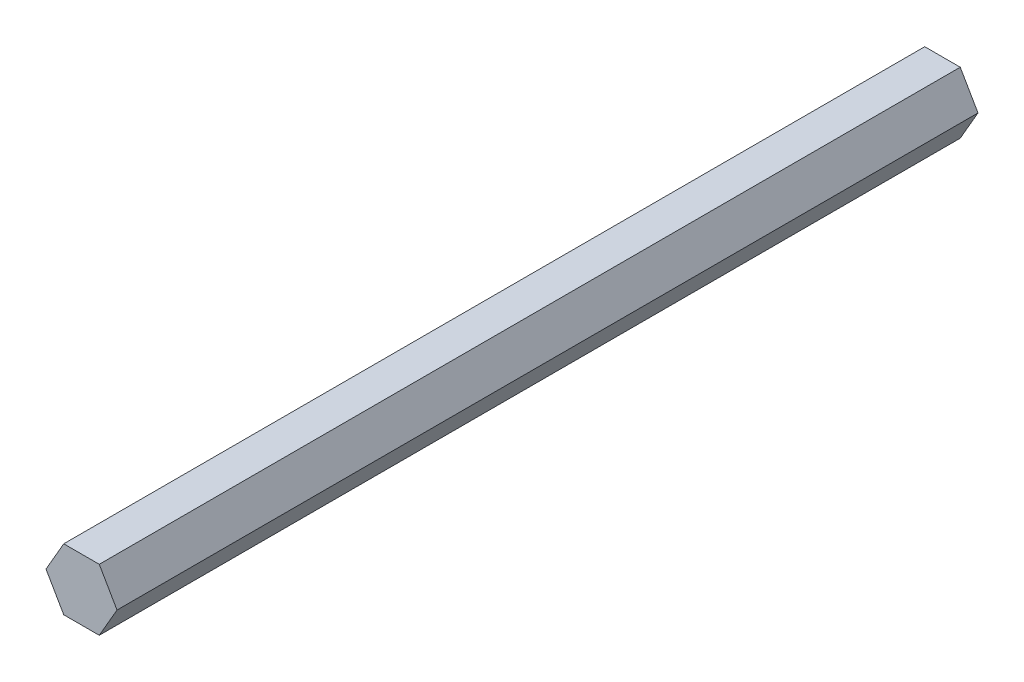
ISO-10303-21;
HEADER;
FILE_DESCRIPTION(('STEP AP214'),'2;1');
FILE_NAME('part.step','',(''),(''),'','','');
FILE_SCHEMA(('AUTOMOTIVE_DESIGN { 1 0 10303 214 1 1 1 1 }'));
ENDSEC;
DATA;
#1=APPLICATION_CONTEXT('core data for automotive mechanical design processes');
#2=APPLICATION_PROTOCOL_DEFINITION('international standard','automotive_design',2000,#1);
#3=PRODUCT_CONTEXT('',#1,'mechanical');
#4=PRODUCT('Part','Part','',(#3));
#5=PRODUCT_RELATED_PRODUCT_CATEGORY('part','',(#4));
#6=PRODUCT_DEFINITION_FORMATION('','',#4);
#7=PRODUCT_DEFINITION_CONTEXT('part definition',#1,'design');
#8=PRODUCT_DEFINITION('design','',#6,#7);
#9=PRODUCT_DEFINITION_SHAPE('','',#8);
#10=(LENGTH_UNIT() NAMED_UNIT(*) SI_UNIT(.MILLI.,.METRE.));
#11=(NAMED_UNIT(*) PLANE_ANGLE_UNIT() SI_UNIT($,.RADIAN.));
#12=(NAMED_UNIT(*) SI_UNIT($,.STERADIAN.) SOLID_ANGLE_UNIT());
#13=UNCERTAINTY_MEASURE_WITH_UNIT(LENGTH_MEASURE(1.E-05),#10,'distance_accuracy_value','');
#14=(GEOMETRIC_REPRESENTATION_CONTEXT(3) GLOBAL_UNCERTAINTY_ASSIGNED_CONTEXT((#13)) GLOBAL_UNIT_ASSIGNED_CONTEXT((#10,
#11,#12)) REPRESENTATION_CONTEXT('',''));
#15=CARTESIAN_POINT('',(0.,0.,0.));
#16=DIRECTION('',(0.,0.,1.));
#17=DIRECTION('',(1.,0.,0.));
#18=AXIS2_PLACEMENT_3D('',#15,#16,#17);
#19=CARTESIAN_POINT('',(7.33234841870825,0.,88.9));
#20=DIRECTION('',(-0.866025403784439,-0.5,0.));
#21=DIRECTION('',(0.5,-0.866025403784439,0.));
#22=AXIS2_PLACEMENT_3D('',#19,#20,#21);
#23=PLANE('',#22);
#24=DIRECTION('',(-0.5,0.866025403784439,0.));
#25=VECTOR('',#24,1.);
#26=CARTESIAN_POINT('',(7.33234841870825,0.,-88.9));
#27=LINE('',#26,#25);
#28=CARTESIAN_POINT('',(7.33234841870825,0.,-88.9));
#29=VERTEX_POINT('',#28);
#30=CARTESIAN_POINT('',(3.66617420935413,6.35,-88.9));
#31=VERTEX_POINT('',#30);
#32=EDGE_CURVE('E117',#29,#31,#27,.T.);
#33=ORIENTED_EDGE('',*,*,#32,.T.);
#34=DIRECTION('',(0.,0.,-1.));
#35=VECTOR('',#34,1.);
#36=CARTESIAN_POINT('',(3.66617420935413,6.35,88.9));
#37=LINE('',#36,#35);
#38=CARTESIAN_POINT('',(3.66617420935413,6.35,88.9));
#39=VERTEX_POINT('',#38);
#40=EDGE_CURVE('E11',#39,#31,#37,.T.);
#41=ORIENTED_EDGE('',*,*,#40,.F.);
#42=DIRECTION('',(-0.5,0.866025403784439,0.));
#43=VECTOR('',#42,1.);
#44=CARTESIAN_POINT('',(7.33234841870825,0.,88.9));
#45=LINE('',#44,#43);
#46=CARTESIAN_POINT('',(7.33234841870825,0.,88.9));
#47=VERTEX_POINT('',#46);
#48=EDGE_CURVE('E127',#47,#39,#45,.T.);
#49=ORIENTED_EDGE('',*,*,#48,.F.);
#50=DIRECTION('',(0.,0.,-1.));
#51=VECTOR('',#50,1.);
#52=CARTESIAN_POINT('',(7.33234841870825,0.,88.9));
#53=LINE('',#52,#51);
#54=EDGE_CURVE('E113',#47,#29,#53,.T.);
#55=ORIENTED_EDGE('',*,*,#54,.T.);
#56=EDGE_LOOP('',(#33,#41,#49,#55));
#57=FACE_BOUND('',#56,.T.);
#58=ADVANCED_FACE('F33',(#57),#23,.F.);
#59=CARTESIAN_POINT('',(3.66617420935413,6.35,88.9));
#60=DIRECTION('',(0.,-1.,0.));
#61=DIRECTION('',(1.,0.,0.));
#62=AXIS2_PLACEMENT_3D('',#59,#60,#61);
#63=PLANE('',#62);
#64=DIRECTION('',(-1.,0.,0.));
#65=VECTOR('',#64,1.);
#66=CARTESIAN_POINT('',(3.66617420935413,6.35,-88.9));
#67=LINE('',#66,#65);
#68=CARTESIAN_POINT('',(-3.66617420935412,6.35,-88.9));
#69=VERTEX_POINT('',#68);
#70=EDGE_CURVE('E120',#31,#69,#67,.T.);
#71=ORIENTED_EDGE('',*,*,#70,.T.);
#72=DIRECTION('',(0.,0.,-1.));
#73=VECTOR('',#72,1.);
#74=CARTESIAN_POINT('',(-3.66617420935412,6.35,88.9));
#75=LINE('',#74,#73);
#76=CARTESIAN_POINT('',(-3.66617420935412,6.35,88.9));
#77=VERTEX_POINT('',#76);
#78=EDGE_CURVE('E41',#77,#69,#75,.T.);
#79=ORIENTED_EDGE('',*,*,#78,.F.);
#80=DIRECTION('',(-1.,0.,0.));
#81=VECTOR('',#80,1.);
#82=CARTESIAN_POINT('',(3.66617420935413,6.35,88.9));
#83=LINE('',#82,#81);
#84=EDGE_CURVE('E86',#39,#77,#83,.T.);
#85=ORIENTED_EDGE('',*,*,#84,.F.);
#86=ORIENTED_EDGE('',*,*,#40,.T.);
#87=EDGE_LOOP('',(#71,#79,#85,#86));
#88=FACE_BOUND('',#87,.T.);
#89=ADVANCED_FACE('F151',(#88),#63,.F.);
#90=CARTESIAN_POINT('',(-3.66617420935412,6.35,88.9));
#91=DIRECTION('',(0.866025403784439,-0.5,0.));
#92=DIRECTION('',(0.5,0.866025403784439,0.));
#93=AXIS2_PLACEMENT_3D('',#90,#91,#92);
#94=PLANE('',#93);
#95=DIRECTION('',(-0.5,-0.866025403784439,0.));
#96=VECTOR('',#95,1.);
#97=CARTESIAN_POINT('',(-3.66617420935412,6.35,-88.9));
#98=LINE('',#97,#96);
#99=CARTESIAN_POINT('',(-7.33234841870824,0.,-88.9));
#100=VERTEX_POINT('',#99);
#101=EDGE_CURVE('E122',#69,#100,#98,.T.);
#102=ORIENTED_EDGE('',*,*,#101,.T.);
#103=DIRECTION('',(0.,0.,-1.));
#104=VECTOR('',#103,1.);
#105=CARTESIAN_POINT('',(-7.33234841870824,0.,88.9));
#106=LINE('',#105,#104);
#107=CARTESIAN_POINT('',(-7.33234841870824,0.,88.9));
#108=VERTEX_POINT('',#107);
#109=EDGE_CURVE('E108',#108,#100,#106,.T.);
#110=ORIENTED_EDGE('',*,*,#109,.F.);
#111=DIRECTION('',(-0.5,-0.866025403784439,0.));
#112=VECTOR('',#111,1.);
#113=CARTESIAN_POINT('',(-3.66617420935412,6.35,88.9));
#114=LINE('',#113,#112);
#115=EDGE_CURVE('E99',#77,#108,#114,.T.);
#116=ORIENTED_EDGE('',*,*,#115,.F.);
#117=ORIENTED_EDGE('',*,*,#78,.T.);
#118=EDGE_LOOP('',(#102,#110,#116,#117));
#119=FACE_BOUND('',#118,.T.);
#120=ADVANCED_FACE('F133',(#119),#94,.F.);
#121=CARTESIAN_POINT('',(-7.33234841870824,0.,88.9));
#122=DIRECTION('',(0.866025403784439,0.5,0.));
#123=DIRECTION('',(-0.5,0.866025403784439,0.));
#124=AXIS2_PLACEMENT_3D('',#121,#122,#123);
#125=PLANE('',#124);
#126=DIRECTION('',(0.5,-0.866025403784439,0.));
#127=VECTOR('',#126,1.);
#128=CARTESIAN_POINT('',(-7.33234841870824,0.,-88.9));
#129=LINE('',#128,#127);
#130=CARTESIAN_POINT('',(-3.66617420935412,-6.35,-88.9));
#131=VERTEX_POINT('',#130);
#132=EDGE_CURVE('E107',#100,#131,#129,.T.);
#133=ORIENTED_EDGE('',*,*,#132,.T.);
#134=DIRECTION('',(0.,0.,-1.));
#135=VECTOR('',#134,1.);
#136=CARTESIAN_POINT('',(-3.66617420935412,-6.35,88.9));
#137=LINE('',#136,#135);
#138=CARTESIAN_POINT('',(-3.66617420935412,-6.35,88.9));
#139=VERTEX_POINT('',#138);
#140=EDGE_CURVE('E104',#139,#131,#137,.T.);
#141=ORIENTED_EDGE('',*,*,#140,.F.);
#142=DIRECTION('',(0.5,-0.866025403784439,0.));
#143=VECTOR('',#142,1.);
#144=CARTESIAN_POINT('',(-7.33234841870824,0.,88.9));
#145=LINE('',#144,#143);
#146=EDGE_CURVE('E93',#108,#139,#145,.T.);
#147=ORIENTED_EDGE('',*,*,#146,.F.);
#148=ORIENTED_EDGE('',*,*,#109,.T.);
#149=EDGE_LOOP('',(#133,#141,#147,#148));
#150=FACE_BOUND('',#149,.T.);
#151=ADVANCED_FACE('F105',(#150),#125,.F.);
#152=CARTESIAN_POINT('',(-3.66617420935412,-6.35,88.9));
#153=DIRECTION('',(0.,1.,0.));
#154=DIRECTION('',(-1.,0.,0.));
#155=AXIS2_PLACEMENT_3D('',#152,#153,#154);
#156=PLANE('',#155);
#157=DIRECTION('',(1.,0.,0.));
#158=VECTOR('',#157,1.);
#159=CARTESIAN_POINT('',(-3.66617420935412,-6.35,-88.9));
#160=LINE('',#159,#158);
#161=CARTESIAN_POINT('',(3.66617420935412,-6.35,-88.9));
#162=VERTEX_POINT('',#161);
#163=EDGE_CURVE('E72',#131,#162,#160,.T.);
#164=ORIENTED_EDGE('',*,*,#163,.T.);
#165=DIRECTION('',(0.,0.,-1.));
#166=VECTOR('',#165,1.);
#167=CARTESIAN_POINT('',(3.66617420935412,-6.35,88.9));
#168=LINE('',#167,#166);
#169=CARTESIAN_POINT('',(3.66617420935412,-6.35,88.9));
#170=VERTEX_POINT('',#169);
#171=EDGE_CURVE('E109',#170,#162,#168,.T.);
#172=ORIENTED_EDGE('',*,*,#171,.F.);
#173=DIRECTION('',(1.,0.,0.));
#174=VECTOR('',#173,1.);
#175=CARTESIAN_POINT('',(-3.66617420935412,-6.35,88.9));
#176=LINE('',#175,#174);
#177=EDGE_CURVE('E97',#139,#170,#176,.T.);
#178=ORIENTED_EDGE('',*,*,#177,.F.);
#179=ORIENTED_EDGE('',*,*,#140,.T.);
#180=EDGE_LOOP('',(#164,#172,#178,#179));
#181=FACE_BOUND('',#180,.T.);
#182=ADVANCED_FACE('F111',(#181),#156,.F.);
#183=CARTESIAN_POINT('',(3.66617420935412,-6.35,88.9));
#184=DIRECTION('',(-0.866025403784439,0.5,0.));
#185=DIRECTION('',(-0.5,-0.866025403784439,0.));
#186=AXIS2_PLACEMENT_3D('',#183,#184,#185);
#187=PLANE('',#186);
#188=DIRECTION('',(0.5,0.866025403784439,0.));
#189=VECTOR('',#188,1.);
#190=CARTESIAN_POINT('',(3.66617420935412,-6.35,-88.9));
#191=LINE('',#190,#189);
#192=EDGE_CURVE('E78',#162,#29,#191,.T.);
#193=ORIENTED_EDGE('',*,*,#192,.T.);
#194=ORIENTED_EDGE('',*,*,#54,.F.);
#195=DIRECTION('',(0.5,0.866025403784439,0.));
#196=VECTOR('',#195,1.);
#197=CARTESIAN_POINT('',(3.66617420935412,-6.35,88.9));
#198=LINE('',#197,#196);
#199=EDGE_CURVE('E49',#170,#47,#198,.T.);
#200=ORIENTED_EDGE('',*,*,#199,.F.);
#201=ORIENTED_EDGE('',*,*,#171,.T.);
#202=EDGE_LOOP('',(#193,#194,#200,#201));
#203=FACE_BOUND('',#202,.T.);
#204=ADVANCED_FACE('F140',(#203),#187,.F.);
#205=CARTESIAN_POINT('',(0.,0.,88.9));
#206=DIRECTION('',(0.,0.,1.));
#207=DIRECTION('',(1.,0.,0.));
#208=AXIS2_PLACEMENT_3D('',#205,#206,#207);
#209=PLANE('',#208);
#210=ORIENTED_EDGE('',*,*,#48,.T.);
#211=ORIENTED_EDGE('',*,*,#84,.T.);
#212=ORIENTED_EDGE('',*,*,#115,.T.);
#213=ORIENTED_EDGE('',*,*,#146,.T.);
#214=ORIENTED_EDGE('',*,*,#177,.T.);
#215=ORIENTED_EDGE('',*,*,#199,.T.);
#216=EDGE_LOOP('',(#210,#211,#212,#213,#214,#215));
#217=FACE_BOUND('',#216,.T.);
#218=ADVANCED_FACE('F95',(#217),#209,.T.);
#219=CARTESIAN_POINT('',(0.,0.,-88.9));
#220=DIRECTION('',(0.,0.,1.));
#221=DIRECTION('',(1.,0.,0.));
#222=AXIS2_PLACEMENT_3D('',#219,#220,#221);
#223=PLANE('',#222);
#224=ORIENTED_EDGE('',*,*,#32,.F.);
#225=ORIENTED_EDGE('',*,*,#192,.F.);
#226=ORIENTED_EDGE('',*,*,#163,.F.);
#227=ORIENTED_EDGE('',*,*,#132,.F.);
#228=ORIENTED_EDGE('',*,*,#101,.F.);
#229=ORIENTED_EDGE('',*,*,#70,.F.);
#230=EDGE_LOOP('',(#224,#225,#226,#227,#228,#229));
#231=FACE_BOUND('',#230,.T.);
#232=ADVANCED_FACE('F136',(#231),#223,.F.);
#233=CLOSED_SHELL('',(#58,#89,#120,#151,#182,#204,#218,#232));
#234=MANIFOLD_SOLID_BREP('B2',#233);
#235=ADVANCED_BREP_SHAPE_REPRESENTATION('',(#18,#234),#14);
#236=SHAPE_DEFINITION_REPRESENTATION(#9,#235);
ENDSEC;
END-ISO-10303-21;
